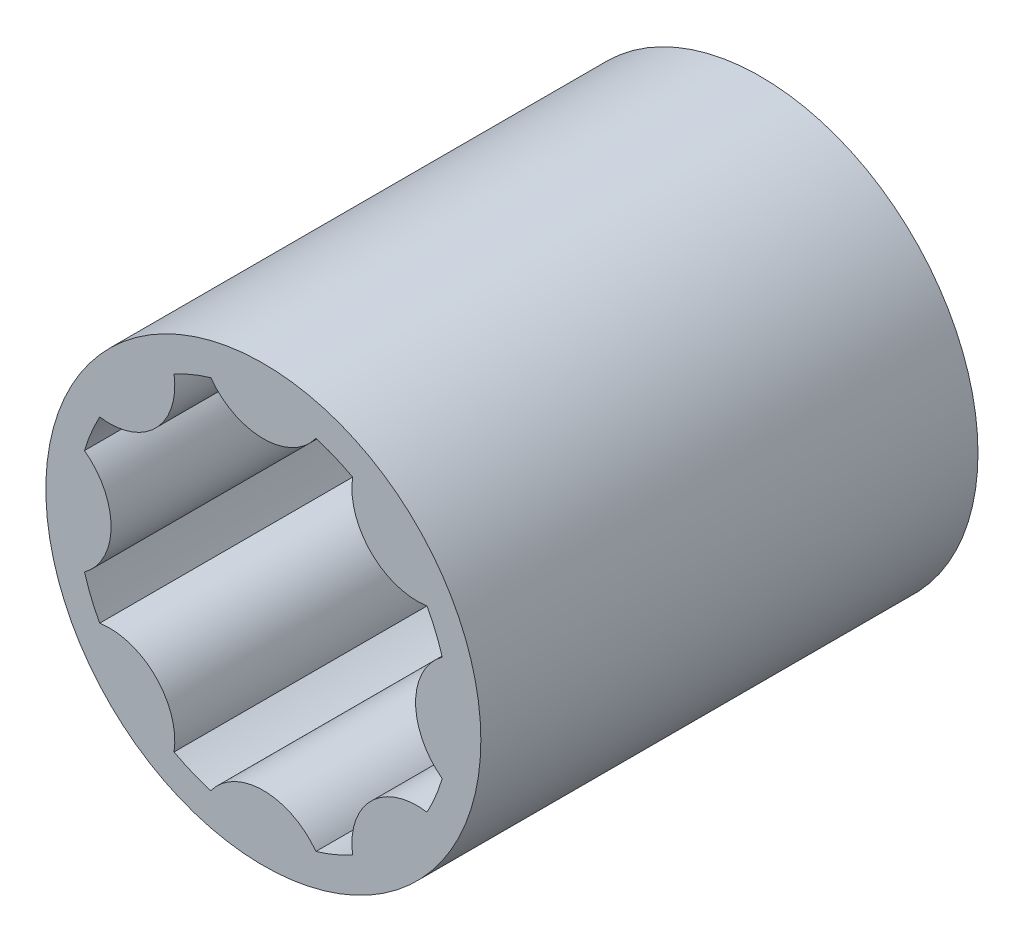
ISO-10303-21;
HEADER;
FILE_DESCRIPTION(('STEP AP214'),'2;1');
FILE_NAME('part.step','',(''),(''),'','','');
FILE_SCHEMA(('AUTOMOTIVE_DESIGN { 1 0 10303 214 1 1 1 1 }'));
ENDSEC;
DATA;
#1=APPLICATION_CONTEXT('core data for automotive mechanical design processes');
#2=APPLICATION_PROTOCOL_DEFINITION('international standard','automotive_design',2000,#1);
#3=PRODUCT_CONTEXT('',#1,'mechanical');
#4=PRODUCT('Part','Part','',(#3));
#5=PRODUCT_RELATED_PRODUCT_CATEGORY('part','',(#4));
#6=PRODUCT_DEFINITION_FORMATION('','',#4);
#7=PRODUCT_DEFINITION_CONTEXT('part definition',#1,'design');
#8=PRODUCT_DEFINITION('design','',#6,#7);
#9=PRODUCT_DEFINITION_SHAPE('','',#8);
#10=(LENGTH_UNIT() NAMED_UNIT(*) SI_UNIT(.MILLI.,.METRE.));
#11=(NAMED_UNIT(*) PLANE_ANGLE_UNIT() SI_UNIT($,.RADIAN.));
#12=(NAMED_UNIT(*) SI_UNIT($,.STERADIAN.) SOLID_ANGLE_UNIT());
#13=UNCERTAINTY_MEASURE_WITH_UNIT(LENGTH_MEASURE(1.E-05),#10,'distance_accuracy_value','');
#14=(GEOMETRIC_REPRESENTATION_CONTEXT(3) GLOBAL_UNCERTAINTY_ASSIGNED_CONTEXT((#13)) GLOBAL_UNIT_ASSIGNED_CONTEXT((#10,
#11,#12)) REPRESENTATION_CONTEXT('',''));
#15=CARTESIAN_POINT('',(0.,0.,0.));
#16=DIRECTION('',(0.,0.,1.));
#17=DIRECTION('',(1.,0.,0.));
#18=AXIS2_PLACEMENT_3D('',#15,#16,#17);
#19=CARTESIAN_POINT('',(0.,0.,40.));
#20=DIRECTION('',(0.,0.,1.));
#21=DIRECTION('',(1.,0.,0.));
#22=AXIS2_PLACEMENT_3D('',#19,#20,#21);
#23=PLANE('',#22);
#24=CARTESIAN_POINT('',(0.,0.,40.));
#25=DIRECTION('',(0.,0.,1.));
#26=DIRECTION('',(1.,0.,0.));
#27=AXIS2_PLACEMENT_3D('',#24,#25,#26);
#28=CIRCLE('',#27,17.5);
#29=CARTESIAN_POINT('',(17.5,0.,40.));
#30=VERTEX_POINT('',#29);
#31=EDGE_CURVE('E11',#30,#30,#28,.T.);
#32=ORIENTED_EDGE('',*,*,#31,.T.);
#33=EDGE_LOOP('',(#32));
#34=FACE_BOUND('',#33,.T.);
#35=CARTESIAN_POINT('',(0.,0.,40.));
#36=DIRECTION('',(0.,0.,1.));
#37=DIRECTION('',(1.,0.,0.));
#38=AXIS2_PLACEMENT_3D('',#35,#36,#37);
#39=CIRCLE('',#38,15.);
#40=CARTESIAN_POINT('',(-4.23049206804066,14.3910714285714,40.));
#41=VERTEX_POINT('',#40);
#42=CARTESIAN_POINT('',(-7.18461456661538,13.1674338247503,40.));
#43=VERTEX_POINT('',#42);
#44=EDGE_CURVE('E156',#41,#43,#39,.T.);
#45=ORIENTED_EDGE('',*,*,#44,.F.);
#46=CARTESIAN_POINT('',(0.,17.5,40.));
#47=DIRECTION('',(0.,0.,-1.));
#48=DIRECTION('',(1.,0.,0.));
#49=AXIS2_PLACEMENT_3D('',#46,#47,#48);
#50=CIRCLE('',#49,5.24999999999999);
#51=CARTESIAN_POINT('',(4.23049206804066,14.3910714285714,40.));
#52=VERTEX_POINT('',#51);
#53=EDGE_CURVE('E148',#52,#41,#50,.T.);
#54=ORIENTED_EDGE('',*,*,#53,.F.);
#55=CARTESIAN_POINT('',(0.,0.,40.));
#56=DIRECTION('',(0.,0.,1.));
#57=DIRECTION('',(1.,0.,0.));
#58=AXIS2_PLACEMENT_3D('',#55,#56,#57);
#59=CIRCLE('',#58,15.);
#60=CARTESIAN_POINT('',(7.18461456661538,13.1674338247503,40.));
#61=VERTEX_POINT('',#60);
#62=EDGE_CURVE('E196',#61,#52,#59,.T.);
#63=ORIENTED_EDGE('',*,*,#62,.F.);
#64=CARTESIAN_POINT('',(12.3743686707646,12.3743686707646,40.));
#65=DIRECTION('',(0.,0.,-1.));
#66=DIRECTION('',(1.,0.,0.));
#67=AXIS2_PLACEMENT_3D('',#64,#65,#66);
#68=CIRCLE('',#67,5.25);
#69=CARTESIAN_POINT('',(13.1674338247503,7.18461456661538,40.));
#70=VERTEX_POINT('',#69);
#71=EDGE_CURVE('E194',#70,#61,#68,.T.);
#72=ORIENTED_EDGE('',*,*,#71,.F.);
#73=CARTESIAN_POINT('',(0.,0.,40.));
#74=DIRECTION('',(0.,0.,1.));
#75=DIRECTION('',(1.,0.,0.));
#76=AXIS2_PLACEMENT_3D('',#73,#74,#75);
#77=CIRCLE('',#76,15.);
#78=CARTESIAN_POINT('',(14.3910714285714,4.23049206804067,40.));
#79=VERTEX_POINT('',#78);
#80=EDGE_CURVE('E192',#79,#70,#77,.T.);
#81=ORIENTED_EDGE('',*,*,#80,.F.);
#82=CARTESIAN_POINT('',(17.5,0.,40.));
#83=DIRECTION('',(0.,0.,-1.));
#84=DIRECTION('',(1.,0.,0.));
#85=AXIS2_PLACEMENT_3D('',#82,#83,#84);
#86=CIRCLE('',#85,5.25);
#87=CARTESIAN_POINT('',(14.3910714285714,-4.23049206804066,40.));
#88=VERTEX_POINT('',#87);
#89=EDGE_CURVE('E190',#88,#79,#86,.T.);
#90=ORIENTED_EDGE('',*,*,#89,.F.);
#91=CARTESIAN_POINT('',(0.,0.,40.));
#92=DIRECTION('',(0.,0.,1.));
#93=DIRECTION('',(1.,0.,0.));
#94=AXIS2_PLACEMENT_3D('',#91,#92,#93);
#95=CIRCLE('',#94,15.);
#96=CARTESIAN_POINT('',(13.1674338247503,-7.18461456661537,40.));
#97=VERTEX_POINT('',#96);
#98=EDGE_CURVE('E188',#97,#88,#95,.T.);
#99=ORIENTED_EDGE('',*,*,#98,.F.);
#100=CARTESIAN_POINT('',(12.3743686707646,-12.3743686707646,40.));
#101=DIRECTION('',(0.,0.,-1.));
#102=DIRECTION('',(1.,0.,0.));
#103=AXIS2_PLACEMENT_3D('',#100,#101,#102);
#104=CIRCLE('',#103,5.25);
#105=CARTESIAN_POINT('',(7.18461456661538,-13.1674338247503,40.));
#106=VERTEX_POINT('',#105);
#107=EDGE_CURVE('E186',#106,#97,#104,.T.);
#108=ORIENTED_EDGE('',*,*,#107,.F.);
#109=CARTESIAN_POINT('',(0.,0.,40.));
#110=DIRECTION('',(0.,0.,1.));
#111=DIRECTION('',(1.,0.,0.));
#112=AXIS2_PLACEMENT_3D('',#109,#110,#111);
#113=CIRCLE('',#112,15.);
#114=CARTESIAN_POINT('',(4.23049206804066,-14.3910714285714,40.));
#115=VERTEX_POINT('',#114);
#116=EDGE_CURVE('E184',#115,#106,#113,.T.);
#117=ORIENTED_EDGE('',*,*,#116,.F.);
#118=CARTESIAN_POINT('',(0.,-17.5,40.));
#119=DIRECTION('',(0.,0.,-1.));
#120=DIRECTION('',(1.,0.,0.));
#121=AXIS2_PLACEMENT_3D('',#118,#119,#120);
#122=CIRCLE('',#121,5.25);
#123=CARTESIAN_POINT('',(-4.23049206804066,-14.3910714285714,40.));
#124=VERTEX_POINT('',#123);
#125=EDGE_CURVE('E182',#124,#115,#122,.T.);
#126=ORIENTED_EDGE('',*,*,#125,.F.);
#127=CARTESIAN_POINT('',(0.,0.,40.));
#128=DIRECTION('',(0.,0.,1.));
#129=DIRECTION('',(1.,0.,0.));
#130=AXIS2_PLACEMENT_3D('',#127,#128,#129);
#131=CIRCLE('',#130,15.);
#132=CARTESIAN_POINT('',(-7.18461456661538,-13.1674338247503,40.));
#133=VERTEX_POINT('',#132);
#134=EDGE_CURVE('E180',#133,#124,#131,.T.);
#135=ORIENTED_EDGE('',*,*,#134,.F.);
#136=CARTESIAN_POINT('',(-12.3743686707646,-12.3743686707646,40.));
#137=DIRECTION('',(0.,0.,-1.));
#138=DIRECTION('',(1.,0.,0.));
#139=AXIS2_PLACEMENT_3D('',#136,#137,#138);
#140=CIRCLE('',#139,5.25);
#141=CARTESIAN_POINT('',(-13.1674338247503,-7.18461456661537,40.));
#142=VERTEX_POINT('',#141);
#143=EDGE_CURVE('E178',#142,#133,#140,.T.);
#144=ORIENTED_EDGE('',*,*,#143,.F.);
#145=CARTESIAN_POINT('',(0.,0.,40.));
#146=DIRECTION('',(0.,0.,1.));
#147=DIRECTION('',(1.,0.,0.));
#148=AXIS2_PLACEMENT_3D('',#145,#146,#147);
#149=CIRCLE('',#148,15.);
#150=CARTESIAN_POINT('',(-14.3910714285714,-4.23049206804066,40.));
#151=VERTEX_POINT('',#150);
#152=EDGE_CURVE('E176',#151,#142,#149,.T.);
#153=ORIENTED_EDGE('',*,*,#152,.F.);
#154=CARTESIAN_POINT('',(-17.5,0.,40.));
#155=DIRECTION('',(0.,0.,-1.));
#156=DIRECTION('',(1.,0.,0.));
#157=AXIS2_PLACEMENT_3D('',#154,#155,#156);
#158=CIRCLE('',#157,5.25);
#159=CARTESIAN_POINT('',(-14.3910714285714,4.23049206804066,40.));
#160=VERTEX_POINT('',#159);
#161=EDGE_CURVE('E174',#160,#151,#158,.T.);
#162=ORIENTED_EDGE('',*,*,#161,.F.);
#163=CARTESIAN_POINT('',(0.,0.,40.));
#164=DIRECTION('',(0.,0.,1.));
#165=DIRECTION('',(1.,0.,0.));
#166=AXIS2_PLACEMENT_3D('',#163,#164,#165);
#167=CIRCLE('',#166,15.);
#168=CARTESIAN_POINT('',(-13.1674338247503,7.18461456661555,40.));
#169=VERTEX_POINT('',#168);
#170=EDGE_CURVE('E170',#169,#160,#167,.T.);
#171=ORIENTED_EDGE('',*,*,#170,.F.);
#172=CARTESIAN_POINT('',(-12.3743686707644,12.3743686707647,40.));
#173=DIRECTION('',(0.,0.,-1.));
#174=DIRECTION('',(1.,0.,0.));
#175=AXIS2_PLACEMENT_3D('',#172,#173,#174);
#176=CIRCLE('',#175,5.24999999999998);
#177=EDGE_CURVE('E168',#43,#169,#176,.T.);
#178=ORIENTED_EDGE('',*,*,#177,.F.);
#179=EDGE_LOOP('',(#45,#54,#63,#72,#81,#90,#99,#108,#117,#126,#135,#144,#153,#162,#171,#178));
#180=FACE_BOUND('',#179,.T.);
#181=ADVANCED_FACE('F35',(#34,#180),#23,.T.);
#182=CARTESIAN_POINT('',(0.,0.,0.));
#183=DIRECTION('',(0.,0.,1.));
#184=DIRECTION('',(1.,0.,0.));
#185=AXIS2_PLACEMENT_3D('',#182,#183,#184);
#186=PLANE('',#185);
#187=CARTESIAN_POINT('',(0.,0.,0.));
#188=DIRECTION('',(0.,0.,1.));
#189=DIRECTION('',(1.,0.,0.));
#190=AXIS2_PLACEMENT_3D('',#187,#188,#189);
#191=CIRCLE('',#190,17.5);
#192=CARTESIAN_POINT('',(17.5,0.,0.));
#193=VERTEX_POINT('',#192);
#194=EDGE_CURVE('E39',#193,#193,#191,.T.);
#195=ORIENTED_EDGE('',*,*,#194,.F.);
#196=EDGE_LOOP('',(#195));
#197=FACE_BOUND('',#196,.T.);
#198=CARTESIAN_POINT('',(0.,17.5,0.));
#199=DIRECTION('',(0.,0.,-1.));
#200=DIRECTION('',(1.,0.,0.));
#201=AXIS2_PLACEMENT_3D('',#198,#199,#200);
#202=CIRCLE('',#201,5.24999999999999);
#203=CARTESIAN_POINT('',(4.23049206804066,14.3910714285714,0.));
#204=VERTEX_POINT('',#203);
#205=CARTESIAN_POINT('',(-4.23049206804066,14.3910714285714,0.));
#206=VERTEX_POINT('',#205);
#207=EDGE_CURVE('E58',#204,#206,#202,.T.);
#208=ORIENTED_EDGE('',*,*,#207,.T.);
#209=CARTESIAN_POINT('',(0.,0.,0.));
#210=DIRECTION('',(0.,0.,1.));
#211=DIRECTION('',(1.,0.,0.));
#212=AXIS2_PLACEMENT_3D('',#209,#210,#211);
#213=CIRCLE('',#212,15.);
#214=CARTESIAN_POINT('',(-7.18461456661538,13.1674338247503,0.));
#215=VERTEX_POINT('',#214);
#216=EDGE_CURVE('E163',#206,#215,#213,.T.);
#217=ORIENTED_EDGE('',*,*,#216,.T.);
#218=CARTESIAN_POINT('',(-12.3743686707644,12.3743686707647,0.));
#219=DIRECTION('',(0.,0.,-1.));
#220=DIRECTION('',(1.,0.,0.));
#221=AXIS2_PLACEMENT_3D('',#218,#219,#220);
#222=CIRCLE('',#221,5.24999999999998);
#223=CARTESIAN_POINT('',(-13.1674338247503,7.18461456661555,0.));
#224=VERTEX_POINT('',#223);
#225=EDGE_CURVE('E200',#215,#224,#222,.T.);
#226=ORIENTED_EDGE('',*,*,#225,.T.);
#227=CARTESIAN_POINT('',(0.,0.,0.));
#228=DIRECTION('',(0.,0.,1.));
#229=DIRECTION('',(1.,0.,0.));
#230=AXIS2_PLACEMENT_3D('',#227,#228,#229);
#231=CIRCLE('',#230,15.);
#232=CARTESIAN_POINT('',(-14.3910714285714,4.23049206804066,0.));
#233=VERTEX_POINT('',#232);
#234=EDGE_CURVE('E203',#224,#233,#231,.T.);
#235=ORIENTED_EDGE('',*,*,#234,.T.);
#236=CARTESIAN_POINT('',(-17.5,0.,0.));
#237=DIRECTION('',(0.,0.,-1.));
#238=DIRECTION('',(1.,0.,0.));
#239=AXIS2_PLACEMENT_3D('',#236,#237,#238);
#240=CIRCLE('',#239,5.25);
#241=CARTESIAN_POINT('',(-14.3910714285714,-4.23049206804066,0.));
#242=VERTEX_POINT('',#241);
#243=EDGE_CURVE('E206',#233,#242,#240,.T.);
#244=ORIENTED_EDGE('',*,*,#243,.T.);
#245=CARTESIAN_POINT('',(0.,0.,0.));
#246=DIRECTION('',(0.,0.,1.));
#247=DIRECTION('',(1.,0.,0.));
#248=AXIS2_PLACEMENT_3D('',#245,#246,#247);
#249=CIRCLE('',#248,15.);
#250=CARTESIAN_POINT('',(-13.1674338247503,-7.18461456661537,0.));
#251=VERTEX_POINT('',#250);
#252=EDGE_CURVE('E209',#242,#251,#249,.T.);
#253=ORIENTED_EDGE('',*,*,#252,.T.);
#254=CARTESIAN_POINT('',(-12.3743686707646,-12.3743686707646,0.));
#255=DIRECTION('',(0.,0.,-1.));
#256=DIRECTION('',(1.,0.,0.));
#257=AXIS2_PLACEMENT_3D('',#254,#255,#256);
#258=CIRCLE('',#257,5.25);
#259=CARTESIAN_POINT('',(-7.18461456661538,-13.1674338247503,0.));
#260=VERTEX_POINT('',#259);
#261=EDGE_CURVE('E212',#251,#260,#258,.T.);
#262=ORIENTED_EDGE('',*,*,#261,.T.);
#263=CARTESIAN_POINT('',(0.,0.,0.));
#264=DIRECTION('',(0.,0.,1.));
#265=DIRECTION('',(1.,0.,0.));
#266=AXIS2_PLACEMENT_3D('',#263,#264,#265);
#267=CIRCLE('',#266,15.);
#268=CARTESIAN_POINT('',(-4.23049206804066,-14.3910714285714,0.));
#269=VERTEX_POINT('',#268);
#270=EDGE_CURVE('E215',#260,#269,#267,.T.);
#271=ORIENTED_EDGE('',*,*,#270,.T.);
#272=CARTESIAN_POINT('',(0.,-17.5,0.));
#273=DIRECTION('',(0.,0.,-1.));
#274=DIRECTION('',(1.,0.,0.));
#275=AXIS2_PLACEMENT_3D('',#272,#273,#274);
#276=CIRCLE('',#275,5.25);
#277=CARTESIAN_POINT('',(4.23049206804066,-14.3910714285714,0.));
#278=VERTEX_POINT('',#277);
#279=EDGE_CURVE('E218',#269,#278,#276,.T.);
#280=ORIENTED_EDGE('',*,*,#279,.T.);
#281=CARTESIAN_POINT('',(0.,0.,0.));
#282=DIRECTION('',(0.,0.,1.));
#283=DIRECTION('',(1.,0.,0.));
#284=AXIS2_PLACEMENT_3D('',#281,#282,#283);
#285=CIRCLE('',#284,15.);
#286=CARTESIAN_POINT('',(7.18461456661538,-13.1674338247503,0.));
#287=VERTEX_POINT('',#286);
#288=EDGE_CURVE('E221',#278,#287,#285,.T.);
#289=ORIENTED_EDGE('',*,*,#288,.T.);
#290=CARTESIAN_POINT('',(12.3743686707646,-12.3743686707646,0.));
#291=DIRECTION('',(0.,0.,-1.));
#292=DIRECTION('',(1.,0.,0.));
#293=AXIS2_PLACEMENT_3D('',#290,#291,#292);
#294=CIRCLE('',#293,5.25);
#295=CARTESIAN_POINT('',(13.1674338247503,-7.18461456661537,0.));
#296=VERTEX_POINT('',#295);
#297=EDGE_CURVE('E224',#287,#296,#294,.T.);
#298=ORIENTED_EDGE('',*,*,#297,.T.);
#299=CARTESIAN_POINT('',(0.,0.,0.));
#300=DIRECTION('',(0.,0.,1.));
#301=DIRECTION('',(1.,0.,0.));
#302=AXIS2_PLACEMENT_3D('',#299,#300,#301);
#303=CIRCLE('',#302,15.);
#304=CARTESIAN_POINT('',(14.3910714285714,-4.23049206804066,0.));
#305=VERTEX_POINT('',#304);
#306=EDGE_CURVE('E227',#296,#305,#303,.T.);
#307=ORIENTED_EDGE('',*,*,#306,.T.);
#308=CARTESIAN_POINT('',(17.5,0.,0.));
#309=DIRECTION('',(0.,0.,-1.));
#310=DIRECTION('',(1.,0.,0.));
#311=AXIS2_PLACEMENT_3D('',#308,#309,#310);
#312=CIRCLE('',#311,5.25);
#313=CARTESIAN_POINT('',(14.3910714285714,4.23049206804067,0.));
#314=VERTEX_POINT('',#313);
#315=EDGE_CURVE('E230',#305,#314,#312,.T.);
#316=ORIENTED_EDGE('',*,*,#315,.T.);
#317=CARTESIAN_POINT('',(0.,0.,0.));
#318=DIRECTION('',(0.,0.,1.));
#319=DIRECTION('',(1.,0.,0.));
#320=AXIS2_PLACEMENT_3D('',#317,#318,#319);
#321=CIRCLE('',#320,15.);
#322=CARTESIAN_POINT('',(13.1674338247503,7.18461456661538,0.));
#323=VERTEX_POINT('',#322);
#324=EDGE_CURVE('E233',#314,#323,#321,.T.);
#325=ORIENTED_EDGE('',*,*,#324,.T.);
#326=CARTESIAN_POINT('',(12.3743686707646,12.3743686707646,0.));
#327=DIRECTION('',(0.,0.,-1.));
#328=DIRECTION('',(1.,0.,0.));
#329=AXIS2_PLACEMENT_3D('',#326,#327,#328);
#330=CIRCLE('',#329,5.25);
#331=CARTESIAN_POINT('',(7.18461456661538,13.1674338247503,0.));
#332=VERTEX_POINT('',#331);
#333=EDGE_CURVE('E236',#323,#332,#330,.T.);
#334=ORIENTED_EDGE('',*,*,#333,.T.);
#335=CARTESIAN_POINT('',(0.,0.,0.));
#336=DIRECTION('',(0.,0.,1.));
#337=DIRECTION('',(1.,0.,0.));
#338=AXIS2_PLACEMENT_3D('',#335,#336,#337);
#339=CIRCLE('',#338,15.);
#340=EDGE_CURVE('E157',#332,#204,#339,.T.);
#341=ORIENTED_EDGE('',*,*,#340,.T.);
#342=EDGE_LOOP('',(#208,#217,#226,#235,#244,#253,#262,#271,#280,#289,#298,#307,#316,#325,#334,#341));
#343=FACE_BOUND('',#342,.T.);
#344=ADVANCED_FACE('F273',(#197,#343),#186,.F.);
#345=CARTESIAN_POINT('',(0.,0.,40.));
#346=DIRECTION('',(0.,0.,-1.));
#347=DIRECTION('',(-1.,0.,0.));
#348=AXIS2_PLACEMENT_3D('',#345,#346,#347);
#349=CYLINDRICAL_SURFACE('',#348,17.5);
#350=ORIENTED_EDGE('',*,*,#31,.F.);
#351=EDGE_LOOP('',(#350));
#352=FACE_BOUND('',#351,.T.);
#353=ORIENTED_EDGE('',*,*,#194,.T.);
#354=EDGE_LOOP('',(#353));
#355=FACE_BOUND('',#354,.T.);
#356=ADVANCED_FACE('F37',(#352,#355),#349,.T.);
#357=CARTESIAN_POINT('',(0.,17.5,40.));
#358=DIRECTION('',(0.,0.,-1.));
#359=DIRECTION('',(-1.,0.,0.));
#360=AXIS2_PLACEMENT_3D('',#357,#358,#359);
#361=CYLINDRICAL_SURFACE('',#360,5.24999999999999);
#362=ORIENTED_EDGE('',*,*,#207,.F.);
#363=DIRECTION('',(0.,0.,-1.));
#364=VECTOR('',#363,1.);
#365=CARTESIAN_POINT('',(4.23049206804066,14.3910714285714,40.));
#366=LINE('',#365,#364);
#367=EDGE_CURVE('E152',#52,#204,#366,.T.);
#368=ORIENTED_EDGE('',*,*,#367,.F.);
#369=ORIENTED_EDGE('',*,*,#53,.T.);
#370=DIRECTION('',(0.,0.,-1.));
#371=VECTOR('',#370,1.);
#372=CARTESIAN_POINT('',(-4.23049206804066,14.3910714285714,40.));
#373=LINE('',#372,#371);
#374=EDGE_CURVE('E151',#41,#206,#373,.T.);
#375=ORIENTED_EDGE('',*,*,#374,.T.);
#376=EDGE_LOOP('',(#362,#368,#369,#375));
#377=FACE_BOUND('',#376,.T.);
#378=ADVANCED_FACE('F150',(#377),#361,.T.);
#379=CARTESIAN_POINT('',(0.,0.,40.));
#380=DIRECTION('',(0.,0.,-1.));
#381=DIRECTION('',(-1.,0.,0.));
#382=AXIS2_PLACEMENT_3D('',#379,#380,#381);
#383=CYLINDRICAL_SURFACE('',#382,15.);
#384=ORIENTED_EDGE('',*,*,#216,.F.);
#385=ORIENTED_EDGE('',*,*,#374,.F.);
#386=ORIENTED_EDGE('',*,*,#44,.T.);
#387=DIRECTION('',(0.,0.,-1.));
#388=VECTOR('',#387,1.);
#389=CARTESIAN_POINT('',(-7.18461456661538,13.1674338247503,40.));
#390=LINE('',#389,#388);
#391=EDGE_CURVE('E164',#43,#215,#390,.T.);
#392=ORIENTED_EDGE('',*,*,#391,.T.);
#393=EDGE_LOOP('',(#384,#385,#386,#392));
#394=FACE_BOUND('',#393,.T.);
#395=ADVANCED_FACE('F160',(#394),#383,.F.);
#396=CARTESIAN_POINT('',(-12.3743686707644,12.3743686707647,40.));
#397=DIRECTION('',(0.,0.,-1.));
#398=DIRECTION('',(-1.,0.,0.));
#399=AXIS2_PLACEMENT_3D('',#396,#397,#398);
#400=CYLINDRICAL_SURFACE('',#399,5.24999999999998);
#401=ORIENTED_EDGE('',*,*,#225,.F.);
#402=ORIENTED_EDGE('',*,*,#391,.F.);
#403=ORIENTED_EDGE('',*,*,#177,.T.);
#404=DIRECTION('',(0.,0.,-1.));
#405=VECTOR('',#404,1.);
#406=CARTESIAN_POINT('',(-13.1674338247503,7.18461456661555,40.));
#407=LINE('',#406,#405);
#408=EDGE_CURVE('E265',#169,#224,#407,.T.);
#409=ORIENTED_EDGE('',*,*,#408,.T.);
#410=EDGE_LOOP('',(#401,#402,#403,#409));
#411=FACE_BOUND('',#410,.T.);
#412=ADVANCED_FACE('F269',(#411),#400,.T.);
#413=CARTESIAN_POINT('',(0.,0.,40.));
#414=DIRECTION('',(0.,0.,-1.));
#415=DIRECTION('',(-1.,0.,0.));
#416=AXIS2_PLACEMENT_3D('',#413,#414,#415);
#417=CYLINDRICAL_SURFACE('',#416,15.);
#418=ORIENTED_EDGE('',*,*,#234,.F.);
#419=ORIENTED_EDGE('',*,*,#408,.F.);
#420=ORIENTED_EDGE('',*,*,#170,.T.);
#421=DIRECTION('',(0.,0.,-1.));
#422=VECTOR('',#421,1.);
#423=CARTESIAN_POINT('',(-14.3910714285714,4.23049206804066,40.));
#424=LINE('',#423,#422);
#425=EDGE_CURVE('E263',#160,#233,#424,.T.);
#426=ORIENTED_EDGE('',*,*,#425,.T.);
#427=EDGE_LOOP('',(#418,#419,#420,#426));
#428=FACE_BOUND('',#427,.T.);
#429=ADVANCED_FACE('F331',(#428),#417,.F.);
#430=CARTESIAN_POINT('',(-17.5,0.,40.));
#431=DIRECTION('',(0.,0.,-1.));
#432=DIRECTION('',(-1.,0.,0.));
#433=AXIS2_PLACEMENT_3D('',#430,#431,#432);
#434=CYLINDRICAL_SURFACE('',#433,5.25);
#435=ORIENTED_EDGE('',*,*,#243,.F.);
#436=ORIENTED_EDGE('',*,*,#425,.F.);
#437=ORIENTED_EDGE('',*,*,#161,.T.);
#438=DIRECTION('',(0.,0.,-1.));
#439=VECTOR('',#438,1.);
#440=CARTESIAN_POINT('',(-14.3910714285714,-4.23049206804066,40.));
#441=LINE('',#440,#439);
#442=EDGE_CURVE('E261',#151,#242,#441,.T.);
#443=ORIENTED_EDGE('',*,*,#442,.T.);
#444=EDGE_LOOP('',(#435,#436,#437,#443));
#445=FACE_BOUND('',#444,.T.);
#446=ADVANCED_FACE('F328',(#445),#434,.T.);
#447=CARTESIAN_POINT('',(0.,0.,40.));
#448=DIRECTION('',(0.,0.,-1.));
#449=DIRECTION('',(-1.,0.,0.));
#450=AXIS2_PLACEMENT_3D('',#447,#448,#449);
#451=CYLINDRICAL_SURFACE('',#450,15.);
#452=ORIENTED_EDGE('',*,*,#252,.F.);
#453=ORIENTED_EDGE('',*,*,#442,.F.);
#454=ORIENTED_EDGE('',*,*,#152,.T.);
#455=DIRECTION('',(0.,0.,-1.));
#456=VECTOR('',#455,1.);
#457=CARTESIAN_POINT('',(-13.1674338247503,-7.18461456661537,40.));
#458=LINE('',#457,#456);
#459=EDGE_CURVE('E259',#142,#251,#458,.T.);
#460=ORIENTED_EDGE('',*,*,#459,.T.);
#461=EDGE_LOOP('',(#452,#453,#454,#460));
#462=FACE_BOUND('',#461,.T.);
#463=ADVANCED_FACE('F325',(#462),#451,.F.);
#464=CARTESIAN_POINT('',(-12.3743686707646,-12.3743686707646,40.));
#465=DIRECTION('',(0.,0.,-1.));
#466=DIRECTION('',(-1.,0.,0.));
#467=AXIS2_PLACEMENT_3D('',#464,#465,#466);
#468=CYLINDRICAL_SURFACE('',#467,5.25);
#469=ORIENTED_EDGE('',*,*,#261,.F.);
#470=ORIENTED_EDGE('',*,*,#459,.F.);
#471=ORIENTED_EDGE('',*,*,#143,.T.);
#472=DIRECTION('',(0.,0.,-1.));
#473=VECTOR('',#472,1.);
#474=CARTESIAN_POINT('',(-7.18461456661538,-13.1674338247503,40.));
#475=LINE('',#474,#473);
#476=EDGE_CURVE('E257',#133,#260,#475,.T.);
#477=ORIENTED_EDGE('',*,*,#476,.T.);
#478=EDGE_LOOP('',(#469,#470,#471,#477));
#479=FACE_BOUND('',#478,.T.);
#480=ADVANCED_FACE('F318',(#479),#468,.T.);
#481=CARTESIAN_POINT('',(0.,0.,40.));
#482=DIRECTION('',(0.,0.,-1.));
#483=DIRECTION('',(-1.,0.,0.));
#484=AXIS2_PLACEMENT_3D('',#481,#482,#483);
#485=CYLINDRICAL_SURFACE('',#484,15.);
#486=ORIENTED_EDGE('',*,*,#270,.F.);
#487=ORIENTED_EDGE('',*,*,#476,.F.);
#488=ORIENTED_EDGE('',*,*,#134,.T.);
#489=DIRECTION('',(0.,0.,-1.));
#490=VECTOR('',#489,1.);
#491=CARTESIAN_POINT('',(-4.23049206804066,-14.3910714285714,40.));
#492=LINE('',#491,#490);
#493=EDGE_CURVE('E255',#124,#269,#492,.T.);
#494=ORIENTED_EDGE('',*,*,#493,.T.);
#495=EDGE_LOOP('',(#486,#487,#488,#494));
#496=FACE_BOUND('',#495,.T.);
#497=ADVANCED_FACE('F314',(#496),#485,.F.);
#498=CARTESIAN_POINT('',(0.,-17.5,40.));
#499=DIRECTION('',(0.,0.,-1.));
#500=DIRECTION('',(-1.,0.,0.));
#501=AXIS2_PLACEMENT_3D('',#498,#499,#500);
#502=CYLINDRICAL_SURFACE('',#501,5.25);
#503=ORIENTED_EDGE('',*,*,#279,.F.);
#504=ORIENTED_EDGE('',*,*,#493,.F.);
#505=ORIENTED_EDGE('',*,*,#125,.T.);
#506=DIRECTION('',(0.,0.,-1.));
#507=VECTOR('',#506,1.);
#508=CARTESIAN_POINT('',(4.23049206804066,-14.3910714285714,40.));
#509=LINE('',#508,#507);
#510=EDGE_CURVE('E253',#115,#278,#509,.T.);
#511=ORIENTED_EDGE('',*,*,#510,.T.);
#512=EDGE_LOOP('',(#503,#504,#505,#511));
#513=FACE_BOUND('',#512,.T.);
#514=ADVANCED_FACE('F311',(#513),#502,.T.);
#515=CARTESIAN_POINT('',(0.,0.,40.));
#516=DIRECTION('',(0.,0.,-1.));
#517=DIRECTION('',(-1.,0.,0.));
#518=AXIS2_PLACEMENT_3D('',#515,#516,#517);
#519=CYLINDRICAL_SURFACE('',#518,15.);
#520=ORIENTED_EDGE('',*,*,#288,.F.);
#521=ORIENTED_EDGE('',*,*,#510,.F.);
#522=ORIENTED_EDGE('',*,*,#116,.T.);
#523=DIRECTION('',(0.,0.,-1.));
#524=VECTOR('',#523,1.);
#525=CARTESIAN_POINT('',(7.18461456661538,-13.1674338247503,40.));
#526=LINE('',#525,#524);
#527=EDGE_CURVE('E251',#106,#287,#526,.T.);
#528=ORIENTED_EDGE('',*,*,#527,.T.);
#529=EDGE_LOOP('',(#520,#521,#522,#528));
#530=FACE_BOUND('',#529,.T.);
#531=ADVANCED_FACE('F303',(#530),#519,.F.);
#532=CARTESIAN_POINT('',(12.3743686707646,-12.3743686707646,40.));
#533=DIRECTION('',(0.,0.,-1.));
#534=DIRECTION('',(-1.,0.,0.));
#535=AXIS2_PLACEMENT_3D('',#532,#533,#534);
#536=CYLINDRICAL_SURFACE('',#535,5.25);
#537=ORIENTED_EDGE('',*,*,#297,.F.);
#538=ORIENTED_EDGE('',*,*,#527,.F.);
#539=ORIENTED_EDGE('',*,*,#107,.T.);
#540=DIRECTION('',(0.,0.,-1.));
#541=VECTOR('',#540,1.);
#542=CARTESIAN_POINT('',(13.1674338247503,-7.18461456661537,40.));
#543=LINE('',#542,#541);
#544=EDGE_CURVE('E249',#97,#296,#543,.T.);
#545=ORIENTED_EDGE('',*,*,#544,.T.);
#546=EDGE_LOOP('',(#537,#538,#539,#545));
#547=FACE_BOUND('',#546,.T.);
#548=ADVANCED_FACE('F299',(#547),#536,.T.);
#549=CARTESIAN_POINT('',(0.,0.,40.));
#550=DIRECTION('',(0.,0.,-1.));
#551=DIRECTION('',(-1.,0.,0.));
#552=AXIS2_PLACEMENT_3D('',#549,#550,#551);
#553=CYLINDRICAL_SURFACE('',#552,15.);
#554=ORIENTED_EDGE('',*,*,#306,.F.);
#555=ORIENTED_EDGE('',*,*,#544,.F.);
#556=ORIENTED_EDGE('',*,*,#98,.T.);
#557=DIRECTION('',(0.,0.,-1.));
#558=VECTOR('',#557,1.);
#559=CARTESIAN_POINT('',(14.3910714285714,-4.23049206804066,40.));
#560=LINE('',#559,#558);
#561=EDGE_CURVE('E247',#88,#305,#560,.T.);
#562=ORIENTED_EDGE('',*,*,#561,.T.);
#563=EDGE_LOOP('',(#554,#555,#556,#562));
#564=FACE_BOUND('',#563,.T.);
#565=ADVANCED_FACE('F296',(#564),#553,.F.);
#566=CARTESIAN_POINT('',(17.5,0.,40.));
#567=DIRECTION('',(0.,0.,-1.));
#568=DIRECTION('',(-1.,0.,0.));
#569=AXIS2_PLACEMENT_3D('',#566,#567,#568);
#570=CYLINDRICAL_SURFACE('',#569,5.25);
#571=ORIENTED_EDGE('',*,*,#315,.F.);
#572=ORIENTED_EDGE('',*,*,#561,.F.);
#573=ORIENTED_EDGE('',*,*,#89,.T.);
#574=DIRECTION('',(0.,0.,-1.));
#575=VECTOR('',#574,1.);
#576=CARTESIAN_POINT('',(14.3910714285714,4.23049206804067,40.));
#577=LINE('',#576,#575);
#578=EDGE_CURVE('E245',#79,#314,#577,.T.);
#579=ORIENTED_EDGE('',*,*,#578,.T.);
#580=EDGE_LOOP('',(#571,#572,#573,#579));
#581=FACE_BOUND('',#580,.T.);
#582=ADVANCED_FACE('F288',(#581),#570,.T.);
#583=CARTESIAN_POINT('',(0.,0.,40.));
#584=DIRECTION('',(0.,0.,-1.));
#585=DIRECTION('',(-1.,0.,0.));
#586=AXIS2_PLACEMENT_3D('',#583,#584,#585);
#587=CYLINDRICAL_SURFACE('',#586,15.);
#588=ORIENTED_EDGE('',*,*,#324,.F.);
#589=ORIENTED_EDGE('',*,*,#578,.F.);
#590=ORIENTED_EDGE('',*,*,#80,.T.);
#591=DIRECTION('',(0.,0.,-1.));
#592=VECTOR('',#591,1.);
#593=CARTESIAN_POINT('',(13.1674338247503,7.18461456661538,40.));
#594=LINE('',#593,#592);
#595=EDGE_CURVE('E243',#70,#323,#594,.T.);
#596=ORIENTED_EDGE('',*,*,#595,.T.);
#597=EDGE_LOOP('',(#588,#589,#590,#596));
#598=FACE_BOUND('',#597,.T.);
#599=ADVANCED_FACE('F284',(#598),#587,.F.);
#600=CARTESIAN_POINT('',(12.3743686707646,12.3743686707646,40.));
#601=DIRECTION('',(0.,0.,-1.));
#602=DIRECTION('',(-1.,0.,0.));
#603=AXIS2_PLACEMENT_3D('',#600,#601,#602);
#604=CYLINDRICAL_SURFACE('',#603,5.25);
#605=ORIENTED_EDGE('',*,*,#333,.F.);
#606=ORIENTED_EDGE('',*,*,#595,.F.);
#607=ORIENTED_EDGE('',*,*,#71,.T.);
#608=DIRECTION('',(0.,0.,-1.));
#609=VECTOR('',#608,1.);
#610=CARTESIAN_POINT('',(7.18461456661538,13.1674338247503,40.));
#611=LINE('',#610,#609);
#612=EDGE_CURVE('E50',#61,#332,#611,.T.);
#613=ORIENTED_EDGE('',*,*,#612,.T.);
#614=EDGE_LOOP('',(#605,#606,#607,#613));
#615=FACE_BOUND('',#614,.T.);
#616=ADVANCED_FACE('F281',(#615),#604,.T.);
#617=CARTESIAN_POINT('',(0.,0.,40.));
#618=DIRECTION('',(0.,0.,-1.));
#619=DIRECTION('',(-1.,0.,0.));
#620=AXIS2_PLACEMENT_3D('',#617,#618,#619);
#621=CYLINDRICAL_SURFACE('',#620,15.);
#622=ORIENTED_EDGE('',*,*,#340,.F.);
#623=ORIENTED_EDGE('',*,*,#612,.F.);
#624=ORIENTED_EDGE('',*,*,#62,.T.);
#625=ORIENTED_EDGE('',*,*,#367,.T.);
#626=EDGE_LOOP('',(#622,#623,#624,#625));
#627=FACE_BOUND('',#626,.T.);
#628=ADVANCED_FACE('F275',(#627),#621,.F.);
#629=CLOSED_SHELL('',(#181,#344,#356,#378,#395,#412,#429,#446,#463,#480,#497,#514,#531,#548,
#565,#582,#599,#616,#628));
#630=MANIFOLD_SOLID_BREP('B2',#629);
#631=ADVANCED_BREP_SHAPE_REPRESENTATION('',(#18,#630),#14);
#632=SHAPE_DEFINITION_REPRESENTATION(#9,#631);
ENDSEC;
END-ISO-10303-21;
